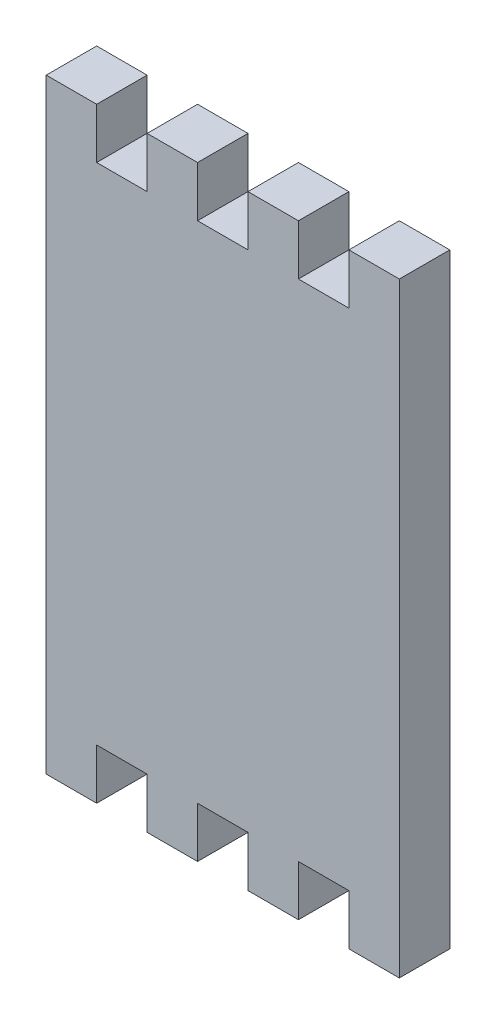
ISO-10303-21;
HEADER;
FILE_DESCRIPTION(('STEP AP214'),'2;1');
FILE_NAME('part.step','',(''),(''),'','','');
FILE_SCHEMA(('AUTOMOTIVE_DESIGN { 1 0 10303 214 1 1 1 1 }'));
ENDSEC;
DATA;
#1=APPLICATION_CONTEXT('core data for automotive mechanical design processes');
#2=APPLICATION_PROTOCOL_DEFINITION('international standard','automotive_design',2000,#1);
#3=PRODUCT_CONTEXT('',#1,'mechanical');
#4=PRODUCT('Part','Part','',(#3));
#5=PRODUCT_RELATED_PRODUCT_CATEGORY('part','',(#4));
#6=PRODUCT_DEFINITION_FORMATION('','',#4);
#7=PRODUCT_DEFINITION_CONTEXT('part definition',#1,'design');
#8=PRODUCT_DEFINITION('design','',#6,#7);
#9=PRODUCT_DEFINITION_SHAPE('','',#8);
#10=(LENGTH_UNIT() NAMED_UNIT(*) SI_UNIT(.MILLI.,.METRE.));
#11=(NAMED_UNIT(*) PLANE_ANGLE_UNIT() SI_UNIT($,.RADIAN.));
#12=(NAMED_UNIT(*) SI_UNIT($,.STERADIAN.) SOLID_ANGLE_UNIT());
#13=UNCERTAINTY_MEASURE_WITH_UNIT(LENGTH_MEASURE(1.E-05),#10,'distance_accuracy_value','');
#14=(GEOMETRIC_REPRESENTATION_CONTEXT(3) GLOBAL_UNCERTAINTY_ASSIGNED_CONTEXT((#13)) GLOBAL_UNIT_ASSIGNED_CONTEXT((#10,
#11,#12)) REPRESENTATION_CONTEXT('',''));
#15=CARTESIAN_POINT('',(0.,0.,0.));
#16=DIRECTION('',(0.,0.,1.));
#17=DIRECTION('',(1.,0.,0.));
#18=AXIS2_PLACEMENT_3D('',#15,#16,#17);
#19=CARTESIAN_POINT('',(12.6163891340635,16.1798923712353,3.));
#20=DIRECTION('',(1.,0.,0.));
#21=DIRECTION('',(0.,1.,0.));
#22=AXIS2_PLACEMENT_3D('',#19,#20,#21);
#23=PLANE('',#22);
#24=DIRECTION('',(0.,-1.,0.));
#25=VECTOR('',#24,1.);
#26=CARTESIAN_POINT('',(12.6163891340635,16.1798923712353,0.));
#27=LINE('',#26,#25);
#28=CARTESIAN_POINT('',(12.6163891340635,16.1798923712353,0.));
#29=VERTEX_POINT('',#28);
#30=CARTESIAN_POINT('',(12.6163891340635,-19.8201076287647,0.));
#31=VERTEX_POINT('',#30);
#32=EDGE_CURVE('E260',#29,#31,#27,.T.);
#33=ORIENTED_EDGE('',*,*,#32,.T.);
#34=DIRECTION('',(0.,0.,-1.));
#35=VECTOR('',#34,1.);
#36=CARTESIAN_POINT('',(12.6163891340635,-19.8201076287647,3.));
#37=LINE('',#36,#35);
#38=CARTESIAN_POINT('',(12.6163891340635,-19.8201076287647,3.));
#39=VERTEX_POINT('',#38);
#40=EDGE_CURVE('E11',#39,#31,#37,.T.);
#41=ORIENTED_EDGE('',*,*,#40,.F.);
#42=DIRECTION('',(0.,-1.,0.));
#43=VECTOR('',#42,1.);
#44=CARTESIAN_POINT('',(12.6163891340635,16.1798923712353,3.));
#45=LINE('',#44,#43);
#46=CARTESIAN_POINT('',(12.6163891340635,16.1798923712353,3.));
#47=VERTEX_POINT('',#46);
#48=EDGE_CURVE('E342',#47,#39,#45,.T.);
#49=ORIENTED_EDGE('',*,*,#48,.F.);
#50=DIRECTION('',(0.,0.,-1.));
#51=VECTOR('',#50,1.);
#52=CARTESIAN_POINT('',(12.6163891340635,16.1798923712353,3.));
#53=LINE('',#52,#51);
#54=EDGE_CURVE('E256',#47,#29,#53,.T.);
#55=ORIENTED_EDGE('',*,*,#54,.T.);
#56=EDGE_LOOP('',(#33,#41,#49,#55));
#57=FACE_BOUND('',#56,.T.);
#58=ADVANCED_FACE('F39',(#57),#23,.F.);
#59=CARTESIAN_POINT('',(12.6163891340635,-19.8201076287647,3.));
#60=DIRECTION('',(0.,1.,0.));
#61=DIRECTION('',(0.,0.,1.));
#62=AXIS2_PLACEMENT_3D('',#59,#60,#61);
#63=PLANE('',#62);
#64=DIRECTION('',(1.,0.,0.));
#65=VECTOR('',#64,1.);
#66=CARTESIAN_POINT('',(12.6163891340635,-19.8201076287647,0.));
#67=LINE('',#66,#65);
#68=CARTESIAN_POINT('',(15.6163891340635,-19.8201076287647,0.));
#69=VERTEX_POINT('',#68);
#70=EDGE_CURVE('E264',#31,#69,#67,.T.);
#71=ORIENTED_EDGE('',*,*,#70,.T.);
#72=DIRECTION('',(0.,0.,-1.));
#73=VECTOR('',#72,1.);
#74=CARTESIAN_POINT('',(15.6163891340635,-19.8201076287647,3.));
#75=LINE('',#74,#73);
#76=CARTESIAN_POINT('',(15.6163891340635,-19.8201076287647,3.));
#77=VERTEX_POINT('',#76);
#78=EDGE_CURVE('E48',#77,#69,#75,.T.);
#79=ORIENTED_EDGE('',*,*,#78,.F.);
#80=DIRECTION('',(1.,0.,0.));
#81=VECTOR('',#80,1.);
#82=CARTESIAN_POINT('',(12.6163891340635,-19.8201076287647,3.));
#83=LINE('',#82,#81);
#84=EDGE_CURVE('E159',#39,#77,#83,.T.);
#85=ORIENTED_EDGE('',*,*,#84,.F.);
#86=ORIENTED_EDGE('',*,*,#40,.T.);
#87=EDGE_LOOP('',(#71,#79,#85,#86));
#88=FACE_BOUND('',#87,.T.);
#89=ADVANCED_FACE('F548',(#88),#63,.F.);
#90=CARTESIAN_POINT('',(15.6163891340635,-16.8201076287647,3.));
#91=DIRECTION('',(-1.,0.,0.));
#92=DIRECTION('',(0.,-1.,0.));
#93=AXIS2_PLACEMENT_3D('',#90,#91,#92);
#94=PLANE('',#93);
#95=DIRECTION('',(0.,1.,0.));
#96=VECTOR('',#95,1.);
#97=CARTESIAN_POINT('',(15.6163891340635,-16.8201076287647,0.));
#98=LINE('',#97,#96);
#99=CARTESIAN_POINT('',(15.6163891340635,-16.8201076287647,0.));
#100=VERTEX_POINT('',#99);
#101=EDGE_CURVE('E267',#69,#100,#98,.T.);
#102=ORIENTED_EDGE('',*,*,#101,.T.);
#103=DIRECTION('',(0.,0.,-1.));
#104=VECTOR('',#103,1.);
#105=CARTESIAN_POINT('',(15.6163891340635,-16.8201076287647,3.));
#106=LINE('',#105,#104);
#107=CARTESIAN_POINT('',(15.6163891340635,-16.8201076287647,3.));
#108=VERTEX_POINT('',#107);
#109=EDGE_CURVE('E433',#108,#100,#106,.T.);
#110=ORIENTED_EDGE('',*,*,#109,.F.);
#111=DIRECTION('',(0.,1.,0.));
#112=VECTOR('',#111,1.);
#113=CARTESIAN_POINT('',(15.6163891340635,-16.8201076287647,3.));
#114=LINE('',#113,#112);
#115=EDGE_CURVE('E443',#77,#108,#114,.T.);
#116=ORIENTED_EDGE('',*,*,#115,.F.);
#117=ORIENTED_EDGE('',*,*,#78,.T.);
#118=EDGE_LOOP('',(#102,#110,#116,#117));
#119=FACE_BOUND('',#118,.T.);
#120=ADVANCED_FACE('F441',(#119),#94,.F.);
#121=CARTESIAN_POINT('',(15.6163891340635,-16.8201076287647,3.));
#122=DIRECTION('',(0.,1.,0.));
#123=DIRECTION('',(-1.,0.,0.));
#124=AXIS2_PLACEMENT_3D('',#121,#122,#123);
#125=PLANE('',#124);
#126=DIRECTION('',(1.,0.,0.));
#127=VECTOR('',#126,1.);
#128=CARTESIAN_POINT('',(15.6163891340635,-16.8201076287647,0.));
#129=LINE('',#128,#127);
#130=CARTESIAN_POINT('',(18.6163891340635,-16.8201076287647,0.));
#131=VERTEX_POINT('',#130);
#132=EDGE_CURVE('E270',#100,#131,#129,.T.);
#133=ORIENTED_EDGE('',*,*,#132,.T.);
#134=DIRECTION('',(0.,0.,-1.));
#135=VECTOR('',#134,1.);
#136=CARTESIAN_POINT('',(18.6163891340635,-16.8201076287647,3.));
#137=LINE('',#136,#135);
#138=CARTESIAN_POINT('',(18.6163891340635,-16.8201076287647,3.));
#139=VERTEX_POINT('',#138);
#140=EDGE_CURVE('E429',#139,#131,#137,.T.);
#141=ORIENTED_EDGE('',*,*,#140,.F.);
#142=DIRECTION('',(1.,0.,0.));
#143=VECTOR('',#142,1.);
#144=CARTESIAN_POINT('',(15.6163891340635,-16.8201076287647,3.));
#145=LINE('',#144,#143);
#146=EDGE_CURVE('E462',#108,#139,#145,.T.);
#147=ORIENTED_EDGE('',*,*,#146,.F.);
#148=ORIENTED_EDGE('',*,*,#109,.T.);
#149=EDGE_LOOP('',(#133,#141,#147,#148));
#150=FACE_BOUND('',#149,.T.);
#151=ADVANCED_FACE('F452',(#150),#125,.F.);
#152=CARTESIAN_POINT('',(18.6163891340635,-16.8201076287647,3.));
#153=DIRECTION('',(1.,0.,0.));
#154=DIRECTION('',(0.,0.,-1.));
#155=AXIS2_PLACEMENT_3D('',#152,#153,#154);
#156=PLANE('',#155);
#157=DIRECTION('',(0.,-1.,0.));
#158=VECTOR('',#157,1.);
#159=CARTESIAN_POINT('',(18.6163891340635,-16.8201076287647,0.));
#160=LINE('',#159,#158);
#161=CARTESIAN_POINT('',(18.6163891340635,-19.8201076287647,0.));
#162=VERTEX_POINT('',#161);
#163=EDGE_CURVE('E273',#131,#162,#160,.T.);
#164=ORIENTED_EDGE('',*,*,#163,.T.);
#165=DIRECTION('',(0.,0.,-1.));
#166=VECTOR('',#165,1.);
#167=CARTESIAN_POINT('',(18.6163891340635,-19.8201076287647,3.));
#168=LINE('',#167,#166);
#169=CARTESIAN_POINT('',(18.6163891340635,-19.8201076287647,3.));
#170=VERTEX_POINT('',#169);
#171=EDGE_CURVE('E425',#170,#162,#168,.T.);
#172=ORIENTED_EDGE('',*,*,#171,.F.);
#173=DIRECTION('',(0.,-1.,0.));
#174=VECTOR('',#173,1.);
#175=CARTESIAN_POINT('',(18.6163891340635,-16.8201076287647,3.));
#176=LINE('',#175,#174);
#177=EDGE_CURVE('E458',#139,#170,#176,.T.);
#178=ORIENTED_EDGE('',*,*,#177,.F.);
#179=ORIENTED_EDGE('',*,*,#140,.T.);
#180=EDGE_LOOP('',(#164,#172,#178,#179));
#181=FACE_BOUND('',#180,.T.);
#182=ADVANCED_FACE('F456',(#181),#156,.F.);
#183=CARTESIAN_POINT('',(18.6163891340635,-19.8201076287647,3.));
#184=DIRECTION('',(0.,1.,0.));
#185=DIRECTION('',(0.,0.,1.));
#186=AXIS2_PLACEMENT_3D('',#183,#184,#185);
#187=PLANE('',#186);
#188=DIRECTION('',(1.,0.,0.));
#189=VECTOR('',#188,1.);
#190=CARTESIAN_POINT('',(18.6163891340635,-19.8201076287647,0.));
#191=LINE('',#190,#189);
#192=CARTESIAN_POINT('',(21.6163891340635,-19.8201076287647,0.));
#193=VERTEX_POINT('',#192);
#194=EDGE_CURVE('E276',#162,#193,#191,.T.);
#195=ORIENTED_EDGE('',*,*,#194,.T.);
#196=DIRECTION('',(0.,0.,-1.));
#197=VECTOR('',#196,1.);
#198=CARTESIAN_POINT('',(21.6163891340635,-19.8201076287647,3.));
#199=LINE('',#198,#197);
#200=CARTESIAN_POINT('',(21.6163891340635,-19.8201076287647,3.));
#201=VERTEX_POINT('',#200);
#202=EDGE_CURVE('E421',#201,#193,#199,.T.);
#203=ORIENTED_EDGE('',*,*,#202,.F.);
#204=DIRECTION('',(1.,0.,0.));
#205=VECTOR('',#204,1.);
#206=CARTESIAN_POINT('',(18.6163891340635,-19.8201076287647,3.));
#207=LINE('',#206,#205);
#208=EDGE_CURVE('E461',#170,#201,#207,.T.);
#209=ORIENTED_EDGE('',*,*,#208,.F.);
#210=ORIENTED_EDGE('',*,*,#171,.T.);
#211=EDGE_LOOP('',(#195,#203,#209,#210));
#212=FACE_BOUND('',#211,.T.);
#213=ADVANCED_FACE('F561',(#212),#187,.F.);
#214=CARTESIAN_POINT('',(21.6163891340635,-16.8201076287647,3.));
#215=DIRECTION('',(-1.,0.,0.));
#216=DIRECTION('',(0.,0.,1.));
#217=AXIS2_PLACEMENT_3D('',#214,#215,#216);
#218=PLANE('',#217);
#219=DIRECTION('',(0.,1.,0.));
#220=VECTOR('',#219,1.);
#221=CARTESIAN_POINT('',(21.6163891340635,-16.8201076287647,0.));
#222=LINE('',#221,#220);
#223=CARTESIAN_POINT('',(21.6163891340635,-16.8201076287647,0.));
#224=VERTEX_POINT('',#223);
#225=EDGE_CURVE('E279',#193,#224,#222,.T.);
#226=ORIENTED_EDGE('',*,*,#225,.T.);
#227=DIRECTION('',(0.,0.,-1.));
#228=VECTOR('',#227,1.);
#229=CARTESIAN_POINT('',(21.6163891340635,-16.8201076287647,3.));
#230=LINE('',#229,#228);
#231=CARTESIAN_POINT('',(21.6163891340635,-16.8201076287647,3.));
#232=VERTEX_POINT('',#231);
#233=EDGE_CURVE('E417',#232,#224,#230,.T.);
#234=ORIENTED_EDGE('',*,*,#233,.F.);
#235=DIRECTION('',(0.,1.,0.));
#236=VECTOR('',#235,1.);
#237=CARTESIAN_POINT('',(21.6163891340635,-16.8201076287647,3.));
#238=LINE('',#237,#236);
#239=EDGE_CURVE('E466',#201,#232,#238,.T.);
#240=ORIENTED_EDGE('',*,*,#239,.F.);
#241=ORIENTED_EDGE('',*,*,#202,.T.);
#242=EDGE_LOOP('',(#226,#234,#240,#241));
#243=FACE_BOUND('',#242,.T.);
#244=ADVANCED_FACE('F564',(#243),#218,.F.);
#245=CARTESIAN_POINT('',(21.6163891340635,-16.8201076287647,3.));
#246=DIRECTION('',(0.,1.,0.));
#247=DIRECTION('',(0.,0.,1.));
#248=AXIS2_PLACEMENT_3D('',#245,#246,#247);
#249=PLANE('',#248);
#250=DIRECTION('',(1.,0.,0.));
#251=VECTOR('',#250,1.);
#252=CARTESIAN_POINT('',(21.6163891340635,-16.8201076287647,0.));
#253=LINE('',#252,#251);
#254=CARTESIAN_POINT('',(24.6163891340635,-16.8201076287647,0.));
#255=VERTEX_POINT('',#254);
#256=EDGE_CURVE('E282',#224,#255,#253,.T.);
#257=ORIENTED_EDGE('',*,*,#256,.T.);
#258=DIRECTION('',(0.,0.,-1.));
#259=VECTOR('',#258,1.);
#260=CARTESIAN_POINT('',(24.6163891340635,-16.8201076287647,3.));
#261=LINE('',#260,#259);
#262=CARTESIAN_POINT('',(24.6163891340635,-16.8201076287647,3.));
#263=VERTEX_POINT('',#262);
#264=EDGE_CURVE('E413',#263,#255,#261,.T.);
#265=ORIENTED_EDGE('',*,*,#264,.F.);
#266=DIRECTION('',(1.,0.,0.));
#267=VECTOR('',#266,1.);
#268=CARTESIAN_POINT('',(21.6163891340635,-16.8201076287647,3.));
#269=LINE('',#268,#267);
#270=EDGE_CURVE('E473',#232,#263,#269,.T.);
#271=ORIENTED_EDGE('',*,*,#270,.F.);
#272=ORIENTED_EDGE('',*,*,#233,.T.);
#273=EDGE_LOOP('',(#257,#265,#271,#272));
#274=FACE_BOUND('',#273,.T.);
#275=ADVANCED_FACE('F568',(#274),#249,.F.);
#276=CARTESIAN_POINT('',(24.6163891340635,-16.8201076287647,3.));
#277=DIRECTION('',(1.,0.,0.));
#278=DIRECTION('',(0.,0.,-1.));
#279=AXIS2_PLACEMENT_3D('',#276,#277,#278);
#280=PLANE('',#279);
#281=DIRECTION('',(0.,-1.,0.));
#282=VECTOR('',#281,1.);
#283=CARTESIAN_POINT('',(24.6163891340635,-16.8201076287647,0.));
#284=LINE('',#283,#282);
#285=CARTESIAN_POINT('',(24.6163891340635,-19.8201076287647,0.));
#286=VERTEX_POINT('',#285);
#287=EDGE_CURVE('E285',#255,#286,#284,.T.);
#288=ORIENTED_EDGE('',*,*,#287,.T.);
#289=DIRECTION('',(0.,0.,-1.));
#290=VECTOR('',#289,1.);
#291=CARTESIAN_POINT('',(24.6163891340635,-19.8201076287647,3.));
#292=LINE('',#291,#290);
#293=CARTESIAN_POINT('',(24.6163891340635,-19.8201076287647,3.));
#294=VERTEX_POINT('',#293);
#295=EDGE_CURVE('E409',#294,#286,#292,.T.);
#296=ORIENTED_EDGE('',*,*,#295,.F.);
#297=DIRECTION('',(0.,-1.,0.));
#298=VECTOR('',#297,1.);
#299=CARTESIAN_POINT('',(24.6163891340635,-16.8201076287647,3.));
#300=LINE('',#299,#298);
#301=EDGE_CURVE('E476',#263,#294,#300,.T.);
#302=ORIENTED_EDGE('',*,*,#301,.F.);
#303=ORIENTED_EDGE('',*,*,#264,.T.);
#304=EDGE_LOOP('',(#288,#296,#302,#303));
#305=FACE_BOUND('',#304,.T.);
#306=ADVANCED_FACE('F572',(#305),#280,.F.);
#307=CARTESIAN_POINT('',(24.6163891340635,-19.8201076287647,3.));
#308=DIRECTION('',(0.,1.,0.));
#309=DIRECTION('',(0.,0.,1.));
#310=AXIS2_PLACEMENT_3D('',#307,#308,#309);
#311=PLANE('',#310);
#312=DIRECTION('',(1.,0.,0.));
#313=VECTOR('',#312,1.);
#314=CARTESIAN_POINT('',(24.6163891340635,-19.8201076287647,0.));
#315=LINE('',#314,#313);
#316=CARTESIAN_POINT('',(27.6163891340635,-19.8201076287647,0.));
#317=VERTEX_POINT('',#316);
#318=EDGE_CURVE('E288',#286,#317,#315,.T.);
#319=ORIENTED_EDGE('',*,*,#318,.T.);
#320=DIRECTION('',(0.,0.,-1.));
#321=VECTOR('',#320,1.);
#322=CARTESIAN_POINT('',(27.6163891340635,-19.8201076287647,3.));
#323=LINE('',#322,#321);
#324=CARTESIAN_POINT('',(27.6163891340635,-19.8201076287647,3.));
#325=VERTEX_POINT('',#324);
#326=EDGE_CURVE('E405',#325,#317,#323,.T.);
#327=ORIENTED_EDGE('',*,*,#326,.F.);
#328=DIRECTION('',(1.,0.,0.));
#329=VECTOR('',#328,1.);
#330=CARTESIAN_POINT('',(24.6163891340635,-19.8201076287647,3.));
#331=LINE('',#330,#329);
#332=EDGE_CURVE('E479',#294,#325,#331,.T.);
#333=ORIENTED_EDGE('',*,*,#332,.F.);
#334=ORIENTED_EDGE('',*,*,#295,.T.);
#335=EDGE_LOOP('',(#319,#327,#333,#334));
#336=FACE_BOUND('',#335,.T.);
#337=ADVANCED_FACE('F576',(#336),#311,.F.);
#338=CARTESIAN_POINT('',(27.6163891340635,-16.8201076287647,3.));
#339=DIRECTION('',(-1.,0.,0.));
#340=DIRECTION('',(0.,0.,1.));
#341=AXIS2_PLACEMENT_3D('',#338,#339,#340);
#342=PLANE('',#341);
#343=DIRECTION('',(0.,1.,0.));
#344=VECTOR('',#343,1.);
#345=CARTESIAN_POINT('',(27.6163891340635,-16.8201076287647,0.));
#346=LINE('',#345,#344);
#347=CARTESIAN_POINT('',(27.6163891340635,-16.8201076287647,0.));
#348=VERTEX_POINT('',#347);
#349=EDGE_CURVE('E291',#317,#348,#346,.T.);
#350=ORIENTED_EDGE('',*,*,#349,.T.);
#351=DIRECTION('',(0.,0.,-1.));
#352=VECTOR('',#351,1.);
#353=CARTESIAN_POINT('',(27.6163891340635,-16.8201076287647,3.));
#354=LINE('',#353,#352);
#355=CARTESIAN_POINT('',(27.6163891340635,-16.8201076287647,3.));
#356=VERTEX_POINT('',#355);
#357=EDGE_CURVE('E401',#356,#348,#354,.T.);
#358=ORIENTED_EDGE('',*,*,#357,.F.);
#359=DIRECTION('',(0.,1.,0.));
#360=VECTOR('',#359,1.);
#361=CARTESIAN_POINT('',(27.6163891340635,-16.8201076287647,3.));
#362=LINE('',#361,#360);
#363=EDGE_CURVE('E482',#325,#356,#362,.T.);
#364=ORIENTED_EDGE('',*,*,#363,.F.);
#365=ORIENTED_EDGE('',*,*,#326,.T.);
#366=EDGE_LOOP('',(#350,#358,#364,#365));
#367=FACE_BOUND('',#366,.T.);
#368=ADVANCED_FACE('F580',(#367),#342,.F.);
#369=CARTESIAN_POINT('',(27.6163891340635,-16.8201076287647,3.));
#370=DIRECTION('',(0.,1.,0.));
#371=DIRECTION('',(0.,0.,1.));
#372=AXIS2_PLACEMENT_3D('',#369,#370,#371);
#373=PLANE('',#372);
#374=DIRECTION('',(1.,0.,0.));
#375=VECTOR('',#374,1.);
#376=CARTESIAN_POINT('',(27.6163891340635,-16.8201076287647,0.));
#377=LINE('',#376,#375);
#378=CARTESIAN_POINT('',(30.6163891340635,-16.8201076287647,0.));
#379=VERTEX_POINT('',#378);
#380=EDGE_CURVE('E294',#348,#379,#377,.T.);
#381=ORIENTED_EDGE('',*,*,#380,.T.);
#382=DIRECTION('',(0.,0.,-1.));
#383=VECTOR('',#382,1.);
#384=CARTESIAN_POINT('',(30.6163891340635,-16.8201076287647,3.));
#385=LINE('',#384,#383);
#386=CARTESIAN_POINT('',(30.6163891340635,-16.8201076287647,3.));
#387=VERTEX_POINT('',#386);
#388=EDGE_CURVE('E397',#387,#379,#385,.T.);
#389=ORIENTED_EDGE('',*,*,#388,.F.);
#390=DIRECTION('',(1.,0.,0.));
#391=VECTOR('',#390,1.);
#392=CARTESIAN_POINT('',(27.6163891340635,-16.8201076287647,3.));
#393=LINE('',#392,#391);
#394=EDGE_CURVE('E485',#356,#387,#393,.T.);
#395=ORIENTED_EDGE('',*,*,#394,.F.);
#396=ORIENTED_EDGE('',*,*,#357,.T.);
#397=EDGE_LOOP('',(#381,#389,#395,#396));
#398=FACE_BOUND('',#397,.T.);
#399=ADVANCED_FACE('F584',(#398),#373,.F.);
#400=CARTESIAN_POINT('',(30.6163891340635,-16.8201076287647,3.));
#401=DIRECTION('',(1.,0.,0.));
#402=DIRECTION('',(0.,1.,0.));
#403=AXIS2_PLACEMENT_3D('',#400,#401,#402);
#404=PLANE('',#403);
#405=DIRECTION('',(0.,-1.,0.));
#406=VECTOR('',#405,1.);
#407=CARTESIAN_POINT('',(30.6163891340635,-16.8201076287647,0.));
#408=LINE('',#407,#406);
#409=CARTESIAN_POINT('',(30.6163891340635,-19.8201076287647,0.));
#410=VERTEX_POINT('',#409);
#411=EDGE_CURVE('E297',#379,#410,#408,.T.);
#412=ORIENTED_EDGE('',*,*,#411,.T.);
#413=DIRECTION('',(0.,0.,-1.));
#414=VECTOR('',#413,1.);
#415=CARTESIAN_POINT('',(30.6163891340635,-19.8201076287647,3.));
#416=LINE('',#415,#414);
#417=CARTESIAN_POINT('',(30.6163891340635,-19.8201076287647,3.));
#418=VERTEX_POINT('',#417);
#419=EDGE_CURVE('E393',#418,#410,#416,.T.);
#420=ORIENTED_EDGE('',*,*,#419,.F.);
#421=DIRECTION('',(0.,-1.,0.));
#422=VECTOR('',#421,1.);
#423=CARTESIAN_POINT('',(30.6163891340635,-16.8201076287647,3.));
#424=LINE('',#423,#422);
#425=EDGE_CURVE('E488',#387,#418,#424,.T.);
#426=ORIENTED_EDGE('',*,*,#425,.F.);
#427=ORIENTED_EDGE('',*,*,#388,.T.);
#428=EDGE_LOOP('',(#412,#420,#426,#427));
#429=FACE_BOUND('',#428,.T.);
#430=ADVANCED_FACE('F588',(#429),#404,.F.);
#431=CARTESIAN_POINT('',(30.6163891340635,-19.8201076287647,3.));
#432=DIRECTION('',(0.,1.,0.));
#433=DIRECTION('',(-1.,0.,0.));
#434=AXIS2_PLACEMENT_3D('',#431,#432,#433);
#435=PLANE('',#434);
#436=DIRECTION('',(1.,0.,0.));
#437=VECTOR('',#436,1.);
#438=CARTESIAN_POINT('',(30.6163891340635,-19.8201076287647,0.));
#439=LINE('',#438,#437);
#440=CARTESIAN_POINT('',(33.6163891340635,-19.8201076287647,0.));
#441=VERTEX_POINT('',#440);
#442=EDGE_CURVE('E300',#410,#441,#439,.T.);
#443=ORIENTED_EDGE('',*,*,#442,.T.);
#444=DIRECTION('',(0.,0.,-1.));
#445=VECTOR('',#444,1.);
#446=CARTESIAN_POINT('',(33.6163891340635,-19.8201076287647,3.));
#447=LINE('',#446,#445);
#448=CARTESIAN_POINT('',(33.6163891340635,-19.8201076287647,3.));
#449=VERTEX_POINT('',#448);
#450=EDGE_CURVE('E389',#449,#441,#447,.T.);
#451=ORIENTED_EDGE('',*,*,#450,.F.);
#452=DIRECTION('',(1.,0.,0.));
#453=VECTOR('',#452,1.);
#454=CARTESIAN_POINT('',(30.6163891340635,-19.8201076287647,3.));
#455=LINE('',#454,#453);
#456=EDGE_CURVE('E491',#418,#449,#455,.T.);
#457=ORIENTED_EDGE('',*,*,#456,.F.);
#458=ORIENTED_EDGE('',*,*,#419,.T.);
#459=EDGE_LOOP('',(#443,#451,#457,#458));
#460=FACE_BOUND('',#459,.T.);
#461=ADVANCED_FACE('F592',(#460),#435,.F.);
#462=CARTESIAN_POINT('',(33.6163891340635,16.1798923712353,3.));
#463=DIRECTION('',(-1.,0.,0.));
#464=DIRECTION('',(0.,0.,1.));
#465=AXIS2_PLACEMENT_3D('',#462,#463,#464);
#466=PLANE('',#465);
#467=DIRECTION('',(0.,1.,0.));
#468=VECTOR('',#467,1.);
#469=CARTESIAN_POINT('',(33.6163891340635,16.1798923712353,0.));
#470=LINE('',#469,#468);
#471=CARTESIAN_POINT('',(33.6163891340635,16.1798923712353,0.));
#472=VERTEX_POINT('',#471);
#473=EDGE_CURVE('E303',#441,#472,#470,.T.);
#474=ORIENTED_EDGE('',*,*,#473,.T.);
#475=DIRECTION('',(0.,0.,-1.));
#476=VECTOR('',#475,1.);
#477=CARTESIAN_POINT('',(33.6163891340635,16.1798923712353,3.));
#478=LINE('',#477,#476);
#479=CARTESIAN_POINT('',(33.6163891340635,16.1798923712353,3.));
#480=VERTEX_POINT('',#479);
#481=EDGE_CURVE('E385',#480,#472,#478,.T.);
#482=ORIENTED_EDGE('',*,*,#481,.F.);
#483=DIRECTION('',(0.,1.,0.));
#484=VECTOR('',#483,1.);
#485=CARTESIAN_POINT('',(33.6163891340635,16.1798923712353,3.));
#486=LINE('',#485,#484);
#487=EDGE_CURVE('E494',#449,#480,#486,.T.);
#488=ORIENTED_EDGE('',*,*,#487,.F.);
#489=ORIENTED_EDGE('',*,*,#450,.T.);
#490=EDGE_LOOP('',(#474,#482,#488,#489));
#491=FACE_BOUND('',#490,.T.);
#492=ADVANCED_FACE('F596',(#491),#466,.F.);
#493=CARTESIAN_POINT('',(30.6163891340635,16.1798923712353,3.));
#494=DIRECTION('',(0.,-1.,0.));
#495=DIRECTION('',(1.,0.,0.));
#496=AXIS2_PLACEMENT_3D('',#493,#494,#495);
#497=PLANE('',#496);
#498=DIRECTION('',(-1.,0.,0.));
#499=VECTOR('',#498,1.);
#500=CARTESIAN_POINT('',(30.6163891340635,16.1798923712353,0.));
#501=LINE('',#500,#499);
#502=CARTESIAN_POINT('',(30.6163891340635,16.1798923712353,0.));
#503=VERTEX_POINT('',#502);
#504=EDGE_CURVE('E306',#472,#503,#501,.T.);
#505=ORIENTED_EDGE('',*,*,#504,.T.);
#506=DIRECTION('',(0.,0.,-1.));
#507=VECTOR('',#506,1.);
#508=CARTESIAN_POINT('',(30.6163891340635,16.1798923712353,3.));
#509=LINE('',#508,#507);
#510=CARTESIAN_POINT('',(30.6163891340635,16.1798923712353,3.));
#511=VERTEX_POINT('',#510);
#512=EDGE_CURVE('E381',#511,#503,#509,.T.);
#513=ORIENTED_EDGE('',*,*,#512,.F.);
#514=DIRECTION('',(-1.,0.,0.));
#515=VECTOR('',#514,1.);
#516=CARTESIAN_POINT('',(30.6163891340635,16.1798923712353,3.));
#517=LINE('',#516,#515);
#518=EDGE_CURVE('E497',#480,#511,#517,.T.);
#519=ORIENTED_EDGE('',*,*,#518,.F.);
#520=ORIENTED_EDGE('',*,*,#481,.T.);
#521=EDGE_LOOP('',(#505,#513,#519,#520));
#522=FACE_BOUND('',#521,.T.);
#523=ADVANCED_FACE('F600',(#522),#497,.F.);
#524=CARTESIAN_POINT('',(30.6163891340635,13.1798923712353,3.));
#525=DIRECTION('',(1.,0.,0.));
#526=DIRECTION('',(0.,1.,0.));
#527=AXIS2_PLACEMENT_3D('',#524,#525,#526);
#528=PLANE('',#527);
#529=DIRECTION('',(0.,-1.,0.));
#530=VECTOR('',#529,1.);
#531=CARTESIAN_POINT('',(30.6163891340635,13.1798923712353,0.));
#532=LINE('',#531,#530);
#533=CARTESIAN_POINT('',(30.6163891340635,13.1798923712353,0.));
#534=VERTEX_POINT('',#533);
#535=EDGE_CURVE('E309',#503,#534,#532,.T.);
#536=ORIENTED_EDGE('',*,*,#535,.T.);
#537=DIRECTION('',(0.,0.,-1.));
#538=VECTOR('',#537,1.);
#539=CARTESIAN_POINT('',(30.6163891340635,13.1798923712353,3.));
#540=LINE('',#539,#538);
#541=CARTESIAN_POINT('',(30.6163891340635,13.1798923712353,3.));
#542=VERTEX_POINT('',#541);
#543=EDGE_CURVE('E377',#542,#534,#540,.T.);
#544=ORIENTED_EDGE('',*,*,#543,.F.);
#545=DIRECTION('',(0.,-1.,0.));
#546=VECTOR('',#545,1.);
#547=CARTESIAN_POINT('',(30.6163891340635,13.1798923712353,3.));
#548=LINE('',#547,#546);
#549=EDGE_CURVE('E500',#511,#542,#548,.T.);
#550=ORIENTED_EDGE('',*,*,#549,.F.);
#551=ORIENTED_EDGE('',*,*,#512,.T.);
#552=EDGE_LOOP('',(#536,#544,#550,#551));
#553=FACE_BOUND('',#552,.T.);
#554=ADVANCED_FACE('F604',(#553),#528,.F.);
#555=CARTESIAN_POINT('',(30.6163891340635,13.1798923712353,3.));
#556=DIRECTION('',(0.,-1.,0.));
#557=DIRECTION('',(0.,0.,-1.));
#558=AXIS2_PLACEMENT_3D('',#555,#556,#557);
#559=PLANE('',#558);
#560=DIRECTION('',(-1.,0.,0.));
#561=VECTOR('',#560,1.);
#562=CARTESIAN_POINT('',(30.6163891340635,13.1798923712353,0.));
#563=LINE('',#562,#561);
#564=CARTESIAN_POINT('',(27.6163891340635,13.1798923712353,0.));
#565=VERTEX_POINT('',#564);
#566=EDGE_CURVE('E312',#534,#565,#563,.T.);
#567=ORIENTED_EDGE('',*,*,#566,.T.);
#568=DIRECTION('',(0.,0.,-1.));
#569=VECTOR('',#568,1.);
#570=CARTESIAN_POINT('',(27.6163891340635,13.1798923712353,3.));
#571=LINE('',#570,#569);
#572=CARTESIAN_POINT('',(27.6163891340635,13.1798923712353,3.));
#573=VERTEX_POINT('',#572);
#574=EDGE_CURVE('E373',#573,#565,#571,.T.);
#575=ORIENTED_EDGE('',*,*,#574,.F.);
#576=DIRECTION('',(-1.,0.,0.));
#577=VECTOR('',#576,1.);
#578=CARTESIAN_POINT('',(30.6163891340635,13.1798923712353,3.));
#579=LINE('',#578,#577);
#580=EDGE_CURVE('E503',#542,#573,#579,.T.);
#581=ORIENTED_EDGE('',*,*,#580,.F.);
#582=ORIENTED_EDGE('',*,*,#543,.T.);
#583=EDGE_LOOP('',(#567,#575,#581,#582));
#584=FACE_BOUND('',#583,.T.);
#585=ADVANCED_FACE('F608',(#584),#559,.F.);
#586=CARTESIAN_POINT('',(27.6163891340635,13.1798923712353,3.));
#587=DIRECTION('',(-1.,0.,0.));
#588=DIRECTION('',(0.,0.,1.));
#589=AXIS2_PLACEMENT_3D('',#586,#587,#588);
#590=PLANE('',#589);
#591=DIRECTION('',(0.,1.,0.));
#592=VECTOR('',#591,1.);
#593=CARTESIAN_POINT('',(27.6163891340635,13.1798923712353,0.));
#594=LINE('',#593,#592);
#595=CARTESIAN_POINT('',(27.6163891340635,16.1798923712353,0.));
#596=VERTEX_POINT('',#595);
#597=EDGE_CURVE('E315',#565,#596,#594,.T.);
#598=ORIENTED_EDGE('',*,*,#597,.T.);
#599=DIRECTION('',(0.,0.,-1.));
#600=VECTOR('',#599,1.);
#601=CARTESIAN_POINT('',(27.6163891340635,16.1798923712353,3.));
#602=LINE('',#601,#600);
#603=CARTESIAN_POINT('',(27.6163891340635,16.1798923712353,3.));
#604=VERTEX_POINT('',#603);
#605=EDGE_CURVE('E369',#604,#596,#602,.T.);
#606=ORIENTED_EDGE('',*,*,#605,.F.);
#607=DIRECTION('',(0.,1.,0.));
#608=VECTOR('',#607,1.);
#609=CARTESIAN_POINT('',(27.6163891340635,13.1798923712353,3.));
#610=LINE('',#609,#608);
#611=EDGE_CURVE('E506',#573,#604,#610,.T.);
#612=ORIENTED_EDGE('',*,*,#611,.F.);
#613=ORIENTED_EDGE('',*,*,#574,.T.);
#614=EDGE_LOOP('',(#598,#606,#612,#613));
#615=FACE_BOUND('',#614,.T.);
#616=ADVANCED_FACE('F612',(#615),#590,.F.);
#617=CARTESIAN_POINT('',(24.6163891340635,16.1798923712353,3.));
#618=DIRECTION('',(0.,-1.,0.));
#619=DIRECTION('',(0.,0.,-1.));
#620=AXIS2_PLACEMENT_3D('',#617,#618,#619);
#621=PLANE('',#620);
#622=DIRECTION('',(-1.,0.,0.));
#623=VECTOR('',#622,1.);
#624=CARTESIAN_POINT('',(24.6163891340635,16.1798923712353,0.));
#625=LINE('',#624,#623);
#626=CARTESIAN_POINT('',(24.6163891340635,16.1798923712353,0.));
#627=VERTEX_POINT('',#626);
#628=EDGE_CURVE('E318',#596,#627,#625,.T.);
#629=ORIENTED_EDGE('',*,*,#628,.T.);
#630=DIRECTION('',(0.,0.,-1.));
#631=VECTOR('',#630,1.);
#632=CARTESIAN_POINT('',(24.6163891340635,16.1798923712353,3.));
#633=LINE('',#632,#631);
#634=CARTESIAN_POINT('',(24.6163891340635,16.1798923712353,3.));
#635=VERTEX_POINT('',#634);
#636=EDGE_CURVE('E365',#635,#627,#633,.T.);
#637=ORIENTED_EDGE('',*,*,#636,.F.);
#638=DIRECTION('',(-1.,0.,0.));
#639=VECTOR('',#638,1.);
#640=CARTESIAN_POINT('',(24.6163891340635,16.1798923712353,3.));
#641=LINE('',#640,#639);
#642=EDGE_CURVE('E509',#604,#635,#641,.T.);
#643=ORIENTED_EDGE('',*,*,#642,.F.);
#644=ORIENTED_EDGE('',*,*,#605,.T.);
#645=EDGE_LOOP('',(#629,#637,#643,#644));
#646=FACE_BOUND('',#645,.T.);
#647=ADVANCED_FACE('F616',(#646),#621,.F.);
#648=CARTESIAN_POINT('',(24.6163891340635,13.1798923712353,3.));
#649=DIRECTION('',(1.,0.,0.));
#650=DIRECTION('',(0.,0.,-1.));
#651=AXIS2_PLACEMENT_3D('',#648,#649,#650);
#652=PLANE('',#651);
#653=DIRECTION('',(0.,-1.,0.));
#654=VECTOR('',#653,1.);
#655=CARTESIAN_POINT('',(24.6163891340635,13.1798923712353,0.));
#656=LINE('',#655,#654);
#657=CARTESIAN_POINT('',(24.6163891340635,13.1798923712353,0.));
#658=VERTEX_POINT('',#657);
#659=EDGE_CURVE('E321',#627,#658,#656,.T.);
#660=ORIENTED_EDGE('',*,*,#659,.T.);
#661=DIRECTION('',(0.,0.,-1.));
#662=VECTOR('',#661,1.);
#663=CARTESIAN_POINT('',(24.6163891340635,13.1798923712353,3.));
#664=LINE('',#663,#662);
#665=CARTESIAN_POINT('',(24.6163891340635,13.1798923712353,3.));
#666=VERTEX_POINT('',#665);
#667=EDGE_CURVE('E361',#666,#658,#664,.T.);
#668=ORIENTED_EDGE('',*,*,#667,.F.);
#669=DIRECTION('',(0.,-1.,0.));
#670=VECTOR('',#669,1.);
#671=CARTESIAN_POINT('',(24.6163891340635,13.1798923712353,3.));
#672=LINE('',#671,#670);
#673=EDGE_CURVE('E512',#635,#666,#672,.T.);
#674=ORIENTED_EDGE('',*,*,#673,.F.);
#675=ORIENTED_EDGE('',*,*,#636,.T.);
#676=EDGE_LOOP('',(#660,#668,#674,#675));
#677=FACE_BOUND('',#676,.T.);
#678=ADVANCED_FACE('F620',(#677),#652,.F.);
#679=CARTESIAN_POINT('',(21.6163891340635,13.1798923712353,3.));
#680=DIRECTION('',(0.,-1.,0.));
#681=DIRECTION('',(0.,0.,-1.));
#682=AXIS2_PLACEMENT_3D('',#679,#680,#681);
#683=PLANE('',#682);
#684=DIRECTION('',(-1.,0.,0.));
#685=VECTOR('',#684,1.);
#686=CARTESIAN_POINT('',(21.6163891340635,13.1798923712353,0.));
#687=LINE('',#686,#685);
#688=CARTESIAN_POINT('',(21.6163891340635,13.1798923712353,0.));
#689=VERTEX_POINT('',#688);
#690=EDGE_CURVE('E324',#658,#689,#687,.T.);
#691=ORIENTED_EDGE('',*,*,#690,.T.);
#692=DIRECTION('',(0.,0.,-1.));
#693=VECTOR('',#692,1.);
#694=CARTESIAN_POINT('',(21.6163891340635,13.1798923712353,3.));
#695=LINE('',#694,#693);
#696=CARTESIAN_POINT('',(21.6163891340635,13.1798923712353,3.));
#697=VERTEX_POINT('',#696);
#698=EDGE_CURVE('E357',#697,#689,#695,.T.);
#699=ORIENTED_EDGE('',*,*,#698,.F.);
#700=DIRECTION('',(-1.,0.,0.));
#701=VECTOR('',#700,1.);
#702=CARTESIAN_POINT('',(21.6163891340635,13.1798923712353,3.));
#703=LINE('',#702,#701);
#704=EDGE_CURVE('E515',#666,#697,#703,.T.);
#705=ORIENTED_EDGE('',*,*,#704,.F.);
#706=ORIENTED_EDGE('',*,*,#667,.T.);
#707=EDGE_LOOP('',(#691,#699,#705,#706));
#708=FACE_BOUND('',#707,.T.);
#709=ADVANCED_FACE('F624',(#708),#683,.F.);
#710=CARTESIAN_POINT('',(21.6163891340635,13.1798923712353,3.));
#711=DIRECTION('',(-1.,0.,0.));
#712=DIRECTION('',(0.,0.,1.));
#713=AXIS2_PLACEMENT_3D('',#710,#711,#712);
#714=PLANE('',#713);
#715=DIRECTION('',(0.,1.,0.));
#716=VECTOR('',#715,1.);
#717=CARTESIAN_POINT('',(21.6163891340635,13.1798923712353,0.));
#718=LINE('',#717,#716);
#719=CARTESIAN_POINT('',(21.6163891340635,16.1798923712353,0.));
#720=VERTEX_POINT('',#719);
#721=EDGE_CURVE('E327',#689,#720,#718,.T.);
#722=ORIENTED_EDGE('',*,*,#721,.T.);
#723=DIRECTION('',(0.,0.,-1.));
#724=VECTOR('',#723,1.);
#725=CARTESIAN_POINT('',(21.6163891340635,16.1798923712353,3.));
#726=LINE('',#725,#724);
#727=CARTESIAN_POINT('',(21.6163891340635,16.1798923712353,3.));
#728=VERTEX_POINT('',#727);
#729=EDGE_CURVE('E353',#728,#720,#726,.T.);
#730=ORIENTED_EDGE('',*,*,#729,.F.);
#731=DIRECTION('',(0.,1.,0.));
#732=VECTOR('',#731,1.);
#733=CARTESIAN_POINT('',(21.6163891340635,13.1798923712353,3.));
#734=LINE('',#733,#732);
#735=EDGE_CURVE('E518',#697,#728,#734,.T.);
#736=ORIENTED_EDGE('',*,*,#735,.F.);
#737=ORIENTED_EDGE('',*,*,#698,.T.);
#738=EDGE_LOOP('',(#722,#730,#736,#737));
#739=FACE_BOUND('',#738,.T.);
#740=ADVANCED_FACE('F628',(#739),#714,.F.);
#741=CARTESIAN_POINT('',(18.6163891340635,16.1798923712353,3.));
#742=DIRECTION('',(0.,-1.,0.));
#743=DIRECTION('',(0.,0.,-1.));
#744=AXIS2_PLACEMENT_3D('',#741,#742,#743);
#745=PLANE('',#744);
#746=DIRECTION('',(-1.,0.,0.));
#747=VECTOR('',#746,1.);
#748=CARTESIAN_POINT('',(18.6163891340635,16.1798923712353,0.));
#749=LINE('',#748,#747);
#750=CARTESIAN_POINT('',(18.6163891340635,16.1798923712353,0.));
#751=VERTEX_POINT('',#750);
#752=EDGE_CURVE('E330',#720,#751,#749,.T.);
#753=ORIENTED_EDGE('',*,*,#752,.T.);
#754=DIRECTION('',(0.,0.,-1.));
#755=VECTOR('',#754,1.);
#756=CARTESIAN_POINT('',(18.6163891340635,16.1798923712353,3.));
#757=LINE('',#756,#755);
#758=CARTESIAN_POINT('',(18.6163891340635,16.1798923712353,3.));
#759=VERTEX_POINT('',#758);
#760=EDGE_CURVE('E349',#759,#751,#757,.T.);
#761=ORIENTED_EDGE('',*,*,#760,.F.);
#762=DIRECTION('',(-1.,0.,0.));
#763=VECTOR('',#762,1.);
#764=CARTESIAN_POINT('',(18.6163891340635,16.1798923712353,3.));
#765=LINE('',#764,#763);
#766=EDGE_CURVE('E521',#728,#759,#765,.T.);
#767=ORIENTED_EDGE('',*,*,#766,.F.);
#768=ORIENTED_EDGE('',*,*,#729,.T.);
#769=EDGE_LOOP('',(#753,#761,#767,#768));
#770=FACE_BOUND('',#769,.T.);
#771=ADVANCED_FACE('F529',(#770),#745,.F.);
#772=CARTESIAN_POINT('',(18.6163891340635,13.1798923712353,3.));
#773=DIRECTION('',(1.,0.,0.));
#774=DIRECTION('',(0.,0.,-1.));
#775=AXIS2_PLACEMENT_3D('',#772,#773,#774);
#776=PLANE('',#775);
#777=DIRECTION('',(0.,-1.,0.));
#778=VECTOR('',#777,1.);
#779=CARTESIAN_POINT('',(18.6163891340635,13.1798923712353,0.));
#780=LINE('',#779,#778);
#781=CARTESIAN_POINT('',(18.6163891340635,13.1798923712353,0.));
#782=VERTEX_POINT('',#781);
#783=EDGE_CURVE('E333',#751,#782,#780,.T.);
#784=ORIENTED_EDGE('',*,*,#783,.T.);
#785=DIRECTION('',(0.,0.,-1.));
#786=VECTOR('',#785,1.);
#787=CARTESIAN_POINT('',(18.6163891340635,13.1798923712353,3.));
#788=LINE('',#787,#786);
#789=CARTESIAN_POINT('',(18.6163891340635,13.1798923712353,3.));
#790=VERTEX_POINT('',#789);
#791=EDGE_CURVE('E249',#790,#782,#788,.T.);
#792=ORIENTED_EDGE('',*,*,#791,.F.);
#793=DIRECTION('',(0.,-1.,0.));
#794=VECTOR('',#793,1.);
#795=CARTESIAN_POINT('',(18.6163891340635,13.1798923712353,3.));
#796=LINE('',#795,#794);
#797=EDGE_CURVE('E238',#759,#790,#796,.T.);
#798=ORIENTED_EDGE('',*,*,#797,.F.);
#799=ORIENTED_EDGE('',*,*,#760,.T.);
#800=EDGE_LOOP('',(#784,#792,#798,#799));
#801=FACE_BOUND('',#800,.T.);
#802=ADVANCED_FACE('F533',(#801),#776,.F.);
#803=CARTESIAN_POINT('',(15.6163891340635,13.1798923712353,3.));
#804=DIRECTION('',(0.,-1.,0.));
#805=DIRECTION('',(0.,0.,-1.));
#806=AXIS2_PLACEMENT_3D('',#803,#804,#805);
#807=PLANE('',#806);
#808=DIRECTION('',(-1.,0.,0.));
#809=VECTOR('',#808,1.);
#810=CARTESIAN_POINT('',(15.6163891340635,13.1798923712353,0.));
#811=LINE('',#810,#809);
#812=CARTESIAN_POINT('',(15.6163891340635,13.1798923712353,0.));
#813=VERTEX_POINT('',#812);
#814=EDGE_CURVE('E247',#782,#813,#811,.T.);
#815=ORIENTED_EDGE('',*,*,#814,.T.);
#816=DIRECTION('',(0.,0.,-1.));
#817=VECTOR('',#816,1.);
#818=CARTESIAN_POINT('',(15.6163891340635,13.1798923712353,3.));
#819=LINE('',#818,#817);
#820=CARTESIAN_POINT('',(15.6163891340635,13.1798923712353,3.));
#821=VERTEX_POINT('',#820);
#822=EDGE_CURVE('E244',#821,#813,#819,.T.);
#823=ORIENTED_EDGE('',*,*,#822,.F.);
#824=DIRECTION('',(-1.,0.,0.));
#825=VECTOR('',#824,1.);
#826=CARTESIAN_POINT('',(15.6163891340635,13.1798923712353,3.));
#827=LINE('',#826,#825);
#828=EDGE_CURVE('E232',#790,#821,#827,.T.);
#829=ORIENTED_EDGE('',*,*,#828,.F.);
#830=ORIENTED_EDGE('',*,*,#791,.T.);
#831=EDGE_LOOP('',(#815,#823,#829,#830));
#832=FACE_BOUND('',#831,.T.);
#833=ADVANCED_FACE('F245',(#832),#807,.F.);
#834=CARTESIAN_POINT('',(15.6163891340635,13.1798923712353,3.));
#835=DIRECTION('',(-1.,0.,0.));
#836=DIRECTION('',(0.,-1.,0.));
#837=AXIS2_PLACEMENT_3D('',#834,#835,#836);
#838=PLANE('',#837);
#839=DIRECTION('',(0.,1.,0.));
#840=VECTOR('',#839,1.);
#841=CARTESIAN_POINT('',(15.6163891340635,13.1798923712353,0.));
#842=LINE('',#841,#840);
#843=CARTESIAN_POINT('',(15.6163891340635,16.1798923712353,0.));
#844=VERTEX_POINT('',#843);
#845=EDGE_CURVE('E145',#813,#844,#842,.T.);
#846=ORIENTED_EDGE('',*,*,#845,.T.);
#847=DIRECTION('',(0.,0.,-1.));
#848=VECTOR('',#847,1.);
#849=CARTESIAN_POINT('',(15.6163891340635,16.1798923712353,3.));
#850=LINE('',#849,#848);
#851=CARTESIAN_POINT('',(15.6163891340635,16.1798923712353,3.));
#852=VERTEX_POINT('',#851);
#853=EDGE_CURVE('E250',#852,#844,#850,.T.);
#854=ORIENTED_EDGE('',*,*,#853,.F.);
#855=DIRECTION('',(0.,1.,0.));
#856=VECTOR('',#855,1.);
#857=CARTESIAN_POINT('',(15.6163891340635,13.1798923712353,3.));
#858=LINE('',#857,#856);
#859=EDGE_CURVE('E236',#821,#852,#858,.T.);
#860=ORIENTED_EDGE('',*,*,#859,.F.);
#861=ORIENTED_EDGE('',*,*,#822,.T.);
#862=EDGE_LOOP('',(#846,#854,#860,#861));
#863=FACE_BOUND('',#862,.T.);
#864=ADVANCED_FACE('F252',(#863),#838,.F.);
#865=CARTESIAN_POINT('',(12.6163891340635,16.1798923712353,3.));
#866=DIRECTION('',(0.,-1.,0.));
#867=DIRECTION('',(1.,0.,0.));
#868=AXIS2_PLACEMENT_3D('',#865,#866,#867);
#869=PLANE('',#868);
#870=DIRECTION('',(-1.,0.,0.));
#871=VECTOR('',#870,1.);
#872=CARTESIAN_POINT('',(12.6163891340635,16.1798923712353,0.));
#873=LINE('',#872,#871);
#874=EDGE_CURVE('E151',#844,#29,#873,.T.);
#875=ORIENTED_EDGE('',*,*,#874,.T.);
#876=ORIENTED_EDGE('',*,*,#54,.F.);
#877=DIRECTION('',(-1.,0.,0.));
#878=VECTOR('',#877,1.);
#879=CARTESIAN_POINT('',(12.6163891340635,16.1798923712353,3.));
#880=LINE('',#879,#878);
#881=EDGE_CURVE('E56',#852,#47,#880,.T.);
#882=ORIENTED_EDGE('',*,*,#881,.F.);
#883=ORIENTED_EDGE('',*,*,#853,.T.);
#884=EDGE_LOOP('',(#875,#876,#882,#883));
#885=FACE_BOUND('',#884,.T.);
#886=ADVANCED_FACE('F537',(#885),#869,.F.);
#887=CARTESIAN_POINT('',(0.,0.,3.));
#888=DIRECTION('',(0.,0.,1.));
#889=DIRECTION('',(1.,0.,0.));
#890=AXIS2_PLACEMENT_3D('',#887,#888,#889);
#891=PLANE('',#890);
#892=ORIENTED_EDGE('',*,*,#48,.T.);
#893=ORIENTED_EDGE('',*,*,#84,.T.);
#894=ORIENTED_EDGE('',*,*,#115,.T.);
#895=ORIENTED_EDGE('',*,*,#146,.T.);
#896=ORIENTED_EDGE('',*,*,#177,.T.);
#897=ORIENTED_EDGE('',*,*,#208,.T.);
#898=ORIENTED_EDGE('',*,*,#239,.T.);
#899=ORIENTED_EDGE('',*,*,#270,.T.);
#900=ORIENTED_EDGE('',*,*,#301,.T.);
#901=ORIENTED_EDGE('',*,*,#332,.T.);
#902=ORIENTED_EDGE('',*,*,#363,.T.);
#903=ORIENTED_EDGE('',*,*,#394,.T.);
#904=ORIENTED_EDGE('',*,*,#425,.T.);
#905=ORIENTED_EDGE('',*,*,#456,.T.);
#906=ORIENTED_EDGE('',*,*,#487,.T.);
#907=ORIENTED_EDGE('',*,*,#518,.T.);
#908=ORIENTED_EDGE('',*,*,#549,.T.);
#909=ORIENTED_EDGE('',*,*,#580,.T.);
#910=ORIENTED_EDGE('',*,*,#611,.T.);
#911=ORIENTED_EDGE('',*,*,#642,.T.);
#912=ORIENTED_EDGE('',*,*,#673,.T.);
#913=ORIENTED_EDGE('',*,*,#704,.T.);
#914=ORIENTED_EDGE('',*,*,#735,.T.);
#915=ORIENTED_EDGE('',*,*,#766,.T.);
#916=ORIENTED_EDGE('',*,*,#797,.T.);
#917=ORIENTED_EDGE('',*,*,#828,.T.);
#918=ORIENTED_EDGE('',*,*,#859,.T.);
#919=ORIENTED_EDGE('',*,*,#881,.T.);
#920=EDGE_LOOP('',(#892,#893,#894,#895,#896,#897,#898,#899,#900,#901,#902,#903,#904,#905,#906,
#907,#908,#909,#910,#911,#912,#913,#914,#915,#916,#917,#918,#919));
#921=FACE_BOUND('',#920,.T.);
#922=ADVANCED_FACE('F234',(#921),#891,.T.);
#923=CARTESIAN_POINT('',(0.,0.,0.));
#924=DIRECTION('',(0.,0.,1.));
#925=DIRECTION('',(1.,0.,0.));
#926=AXIS2_PLACEMENT_3D('',#923,#924,#925);
#927=PLANE('',#926);
#928=ORIENTED_EDGE('',*,*,#32,.F.);
#929=ORIENTED_EDGE('',*,*,#874,.F.);
#930=ORIENTED_EDGE('',*,*,#845,.F.);
#931=ORIENTED_EDGE('',*,*,#814,.F.);
#932=ORIENTED_EDGE('',*,*,#783,.F.);
#933=ORIENTED_EDGE('',*,*,#752,.F.);
#934=ORIENTED_EDGE('',*,*,#721,.F.);
#935=ORIENTED_EDGE('',*,*,#690,.F.);
#936=ORIENTED_EDGE('',*,*,#659,.F.);
#937=ORIENTED_EDGE('',*,*,#628,.F.);
#938=ORIENTED_EDGE('',*,*,#597,.F.);
#939=ORIENTED_EDGE('',*,*,#566,.F.);
#940=ORIENTED_EDGE('',*,*,#535,.F.);
#941=ORIENTED_EDGE('',*,*,#504,.F.);
#942=ORIENTED_EDGE('',*,*,#473,.F.);
#943=ORIENTED_EDGE('',*,*,#442,.F.);
#944=ORIENTED_EDGE('',*,*,#411,.F.);
#945=ORIENTED_EDGE('',*,*,#380,.F.);
#946=ORIENTED_EDGE('',*,*,#349,.F.);
#947=ORIENTED_EDGE('',*,*,#318,.F.);
#948=ORIENTED_EDGE('',*,*,#287,.F.);
#949=ORIENTED_EDGE('',*,*,#256,.F.);
#950=ORIENTED_EDGE('',*,*,#225,.F.);
#951=ORIENTED_EDGE('',*,*,#194,.F.);
#952=ORIENTED_EDGE('',*,*,#163,.F.);
#953=ORIENTED_EDGE('',*,*,#132,.F.);
#954=ORIENTED_EDGE('',*,*,#101,.F.);
#955=ORIENTED_EDGE('',*,*,#70,.F.);
#956=EDGE_LOOP('',(#928,#929,#930,#931,#932,#933,#934,#935,#936,#937,#938,#939,#940,#941,#942,
#943,#944,#945,#946,#947,#948,#949,#950,#951,#952,#953,#954,#955));
#957=FACE_BOUND('',#956,.T.);
#958=ADVANCED_FACE('F447',(#957),#927,.F.);
#959=CLOSED_SHELL('',(#58,#89,#120,#151,#182,#213,#244,#275,#306,#337,#368,#399,#430,#461,#492,
#523,#554,#585,#616,#647,#678,#709,#740,#771,#802,#833,#864,#886,#922,#958));
#960=MANIFOLD_SOLID_BREP('B2',#959);
#961=ADVANCED_BREP_SHAPE_REPRESENTATION('',(#18,#960),#14);
#962=SHAPE_DEFINITION_REPRESENTATION(#9,#961);
ENDSEC;
END-ISO-10303-21;
